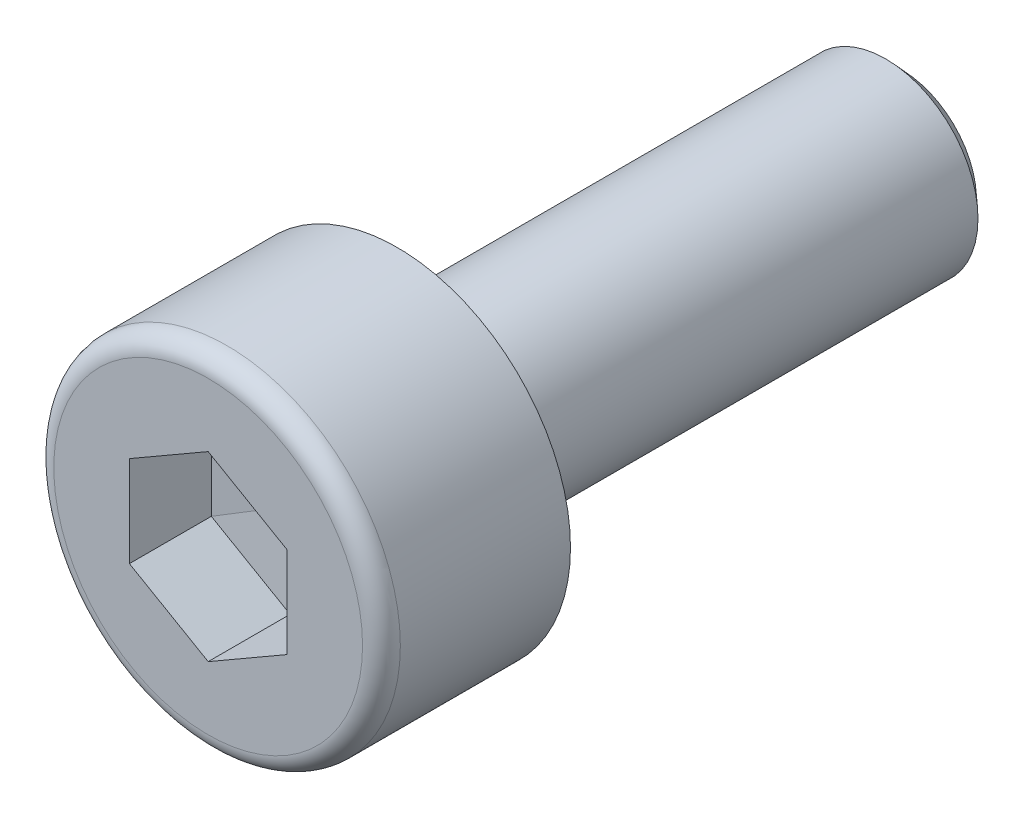
ISO-10303-21;
HEADER;
FILE_DESCRIPTION(('STEP AP214'),'2;1');
FILE_NAME('part.step','',(''),(''),'','','');
FILE_SCHEMA(('AUTOMOTIVE_DESIGN { 1 0 10303 214 1 1 1 1 }'));
ENDSEC;
DATA;
#1=APPLICATION_CONTEXT('core data for automotive mechanical design processes');
#2=APPLICATION_PROTOCOL_DEFINITION('international standard','automotive_design',2000,#1);
#3=PRODUCT_CONTEXT('',#1,'mechanical');
#4=PRODUCT('Part','Part','',(#3));
#5=PRODUCT_RELATED_PRODUCT_CATEGORY('part','',(#4));
#6=PRODUCT_DEFINITION_FORMATION('','',#4);
#7=PRODUCT_DEFINITION_CONTEXT('part definition',#1,'design');
#8=PRODUCT_DEFINITION('design','',#6,#7);
#9=PRODUCT_DEFINITION_SHAPE('','',#8);
#10=(LENGTH_UNIT() NAMED_UNIT(*) SI_UNIT(.MILLI.,.METRE.));
#11=(NAMED_UNIT(*) PLANE_ANGLE_UNIT() SI_UNIT($,.RADIAN.));
#12=(NAMED_UNIT(*) SI_UNIT($,.STERADIAN.) SOLID_ANGLE_UNIT());
#13=UNCERTAINTY_MEASURE_WITH_UNIT(LENGTH_MEASURE(1.E-05),#10,'distance_accuracy_value','');
#14=(GEOMETRIC_REPRESENTATION_CONTEXT(3) GLOBAL_UNCERTAINTY_ASSIGNED_CONTEXT((#13)) GLOBAL_UNIT_ASSIGNED_CONTEXT((#10,
#11,#12)) REPRESENTATION_CONTEXT('',''));
#15=CARTESIAN_POINT('',(0.,0.,0.));
#16=DIRECTION('',(0.,0.,1.));
#17=DIRECTION('',(1.,0.,0.));
#18=AXIS2_PLACEMENT_3D('',#15,#16,#17);
#19=CARTESIAN_POINT('',(-1.49999999999993,0.,0.));
#20=DIRECTION('',(0.,0.,-1.));
#21=DIRECTION('',(0.,-1.,0.));
#22=AXIS2_PLACEMENT_3D('',#19,#20,#21);
#23=PLANE('',#22);
#24=CARTESIAN_POINT('',(0.,0.,0.));
#25=DIRECTION('',(0.,0.,-1.));
#26=DIRECTION('',(-1.,0.,0.));
#27=AXIS2_PLACEMENT_3D('',#24,#25,#26);
#28=CIRCLE('',#27,1.4635);
#29=CARTESIAN_POINT('',(-1.4635,0.,0.));
#30=VERTEX_POINT('',#29);
#31=EDGE_CURVE('E11',#30,#30,#28,.T.);
#32=ORIENTED_EDGE('',*,*,#31,.F.);
#33=EDGE_LOOP('',(#32));
#34=FACE_BOUND('',#33,.T.);
#35=CARTESIAN_POINT('',(0.,0.,-1.23952072181313E-13));
#36=DIRECTION('',(0.,0.,-1.));
#37=DIRECTION('',(1.,0.,0.));
#38=AXIS2_PLACEMENT_3D('',#35,#36,#37);
#39=CIRCLE('',#38,2.74999999999993);
#40=CARTESIAN_POINT('',(2.74999999999993,0.,-1.21303967533006E-13));
#41=VERTEX_POINT('',#40);
#42=EDGE_CURVE('E115',#41,#41,#39,.T.);
#43=ORIENTED_EDGE('',*,*,#42,.T.);
#44=EDGE_LOOP('',(#43));
#45=FACE_BOUND('',#44,.T.);
#46=ADVANCED_FACE('F17',(#34,#45),#23,.T.);
#47=CARTESIAN_POINT('',(0.,0.,-8.));
#48=DIRECTION('',(0.,0.,-1.));
#49=DIRECTION('',(0.,-1.,0.));
#50=AXIS2_PLACEMENT_3D('',#47,#48,#49);
#51=PLANE('',#50);
#52=CARTESIAN_POINT('',(0.,0.,-8.));
#53=DIRECTION('',(0.,0.,-1.));
#54=DIRECTION('',(-1.,0.,0.));
#55=AXIS2_PLACEMENT_3D('',#52,#53,#54);
#56=CIRCLE('',#55,1.193275);
#57=CARTESIAN_POINT('',(-1.193275,0.,-8.));
#58=VERTEX_POINT('',#57);
#59=EDGE_CURVE('E183',#58,#58,#56,.T.);
#60=ORIENTED_EDGE('',*,*,#59,.T.);
#61=EDGE_LOOP('',(#60));
#62=FACE_BOUND('',#61,.T.);
#63=ADVANCED_FACE('F273',(#62),#51,.T.);
#64=CARTESIAN_POINT('',(0.,0.,-4.));
#65=DIRECTION('',(0.,0.,-1.));
#66=DIRECTION('',(-1.,0.,0.));
#67=AXIS2_PLACEMENT_3D('',#64,#65,#66);
#68=CYLINDRICAL_SURFACE('',#67,1.4635);
#69=ORIENTED_EDGE('',*,*,#31,.T.);
#70=EDGE_LOOP('',(#69));
#71=FACE_BOUND('',#70,.T.);
#72=CARTESIAN_POINT('',(0.,0.,-7.75385028398548));
#73=DIRECTION('',(0.,0.,1.));
#74=DIRECTION('',(-1.,0.,0.));
#75=AXIS2_PLACEMENT_3D('',#72,#73,#74);
#76=CIRCLE('',#75,1.4635);
#77=CARTESIAN_POINT('',(-1.46349999999999,0.,-7.75385028398548));
#78=VERTEX_POINT('',#77);
#79=EDGE_CURVE('E180',#78,#78,#76,.T.);
#80=ORIENTED_EDGE('',*,*,#79,.T.);
#81=EDGE_LOOP('',(#80));
#82=FACE_BOUND('',#81,.T.);
#83=ADVANCED_FACE('F257',(#71,#82),#68,.T.);
#84=CARTESIAN_POINT('',(0.,-1.44337567297406,3.));
#85=DIRECTION('',(-0.5,-0.86602540378444,0.));
#86=DIRECTION('',(-0.86602540378444,0.5,0.));
#87=AXIS2_PLACEMENT_3D('',#84,#85,#86);
#88=PLANE('',#87);
#89=DIRECTION('',(-0.86602540378444,0.5,0.));
#90=VECTOR('',#89,1.);
#91=CARTESIAN_POINT('',(-1.34375,-0.667561248750523,2.99999999999987));
#92=LINE('',#91,#90);
#93=CARTESIAN_POINT('',(0.,-1.44337567297406,3.));
#94=VERTEX_POINT('',#93);
#95=CARTESIAN_POINT('',(-1.25000000000003,-0.721687836487028,3.));
#96=VERTEX_POINT('',#95);
#97=EDGE_CURVE('E198',#94,#96,#92,.T.);
#98=ORIENTED_EDGE('',*,*,#97,.F.);
#99=DIRECTION('',(0.,0.,-1.));
#100=VECTOR('',#99,1.);
#101=CARTESIAN_POINT('',(0.,-1.44337567297406,3.));
#102=LINE('',#101,#100);
#103=CARTESIAN_POINT('',(0.,-1.44337567297406,1.7));
#104=VERTEX_POINT('',#103);
#105=EDGE_CURVE('E105',#94,#104,#102,.T.);
#106=ORIENTED_EDGE('',*,*,#105,.T.);
#107=DIRECTION('',(-0.86602540378444,0.5,0.));
#108=VECTOR('',#107,1.);
#109=CARTESIAN_POINT('',(-1.25000000000003,-0.721687836487028,1.7));
#110=LINE('',#109,#108);
#111=CARTESIAN_POINT('',(-1.25000000000003,-0.721687836487028,1.7));
#112=VERTEX_POINT('',#111);
#113=EDGE_CURVE('E164',#104,#112,#110,.T.);
#114=ORIENTED_EDGE('',*,*,#113,.T.);
#115=DIRECTION('',(0.,0.,-1.));
#116=VECTOR('',#115,1.);
#117=CARTESIAN_POINT('',(-1.25000000000003,-0.721687836487028,3.));
#118=LINE('',#117,#116);
#119=EDGE_CURVE('E25',#96,#112,#118,.T.);
#120=ORIENTED_EDGE('',*,*,#119,.F.);
#121=EDGE_LOOP('',(#98,#106,#114,#120));
#122=FACE_BOUND('',#121,.T.);
#123=ADVANCED_FACE('F219',(#122),#88,.F.);
#124=CARTESIAN_POINT('',(-1.25000000000003,-0.721687836487028,3.));
#125=DIRECTION('',(-1.,0.,0.));
#126=DIRECTION('',(0.,0.,1.));
#127=AXIS2_PLACEMENT_3D('',#124,#125,#126);
#128=PLANE('',#127);
#129=DIRECTION('',(0.,1.,0.));
#130=VECTOR('',#129,1.);
#131=CARTESIAN_POINT('',(-1.25000000000003,-0.360843918243514,2.99999999999987));
#132=LINE('',#131,#130);
#133=CARTESIAN_POINT('',(-1.25000000000003,0.72168783648703,3.));
#134=VERTEX_POINT('',#133);
#135=EDGE_CURVE('E127',#96,#134,#132,.T.);
#136=ORIENTED_EDGE('',*,*,#135,.F.);
#137=ORIENTED_EDGE('',*,*,#119,.T.);
#138=DIRECTION('',(0.,1.,0.));
#139=VECTOR('',#138,1.);
#140=CARTESIAN_POINT('',(-1.25000000000003,0.72168783648703,1.7));
#141=LINE('',#140,#139);
#142=CARTESIAN_POINT('',(-1.25000000000003,0.72168783648703,1.7));
#143=VERTEX_POINT('',#142);
#144=EDGE_CURVE('E158',#112,#143,#141,.T.);
#145=ORIENTED_EDGE('',*,*,#144,.T.);
#146=DIRECTION('',(0.,0.,-1.));
#147=VECTOR('',#146,1.);
#148=CARTESIAN_POINT('',(-1.25000000000003,0.72168783648703,3.));
#149=LINE('',#148,#147);
#150=EDGE_CURVE('E46',#134,#143,#149,.T.);
#151=ORIENTED_EDGE('',*,*,#150,.F.);
#152=EDGE_LOOP('',(#136,#137,#145,#151));
#153=FACE_BOUND('',#152,.T.);
#154=ADVANCED_FACE('F379',(#153),#128,.F.);
#155=CARTESIAN_POINT('',(-1.25000000000003,0.72168783648703,3.));
#156=DIRECTION('',(-0.499999999999974,0.866025403784454,0.));
#157=DIRECTION('',(0.,0.,1.));
#158=AXIS2_PLACEMENT_3D('',#155,#156,#157);
#159=PLANE('',#158);
#160=DIRECTION('',(0.866025403784453,0.499999999999974,0.));
#161=VECTOR('',#160,1.);
#162=CARTESIAN_POINT('',(-1.96875,0.306717330507028,2.99999999999987));
#163=LINE('',#162,#161);
#164=CARTESIAN_POINT('',(0.,1.44337567297404,3.));
#165=VERTEX_POINT('',#164);
#166=EDGE_CURVE('E120',#134,#165,#163,.T.);
#167=ORIENTED_EDGE('',*,*,#166,.F.);
#168=ORIENTED_EDGE('',*,*,#150,.T.);
#169=DIRECTION('',(0.866025403784453,0.499999999999974,0.));
#170=VECTOR('',#169,1.);
#171=CARTESIAN_POINT('',(0.,1.44337567297404,1.7));
#172=LINE('',#171,#170);
#173=CARTESIAN_POINT('',(0.,1.44337567297404,1.7));
#174=VERTEX_POINT('',#173);
#175=EDGE_CURVE('E151',#143,#174,#172,.T.);
#176=ORIENTED_EDGE('',*,*,#175,.T.);
#177=DIRECTION('',(0.,0.,-1.));
#178=VECTOR('',#177,1.);
#179=CARTESIAN_POINT('',(0.,1.44337567297404,3.));
#180=LINE('',#179,#178);
#181=EDGE_CURVE('E104',#165,#174,#180,.T.);
#182=ORIENTED_EDGE('',*,*,#181,.F.);
#183=EDGE_LOOP('',(#167,#168,#176,#182));
#184=FACE_BOUND('',#183,.T.);
#185=ADVANCED_FACE('F434',(#184),#159,.F.);
#186=CARTESIAN_POINT('',(0.,1.44337567297404,3.));
#187=DIRECTION('',(0.5,0.866025403784439,0.));
#188=DIRECTION('',(0.,0.,-1.));
#189=AXIS2_PLACEMENT_3D('',#186,#187,#188);
#190=PLANE('',#189);
#191=DIRECTION('',(0.866025403784439,-0.5,0.));
#192=VECTOR('',#191,1.);
#193=CARTESIAN_POINT('',(-0.718749999999979,1.85834617895407,2.99999999999987));
#194=LINE('',#193,#192);
#195=CARTESIAN_POINT('',(1.24999999999997,0.721687836487028,3.));
#196=VERTEX_POINT('',#195);
#197=EDGE_CURVE('E96',#165,#196,#194,.T.);
#198=ORIENTED_EDGE('',*,*,#197,.F.);
#199=ORIENTED_EDGE('',*,*,#181,.T.);
#200=DIRECTION('',(0.866025403784439,-0.5,0.));
#201=VECTOR('',#200,1.);
#202=CARTESIAN_POINT('',(1.24999999999997,0.721687836487028,1.7));
#203=LINE('',#202,#201);
#204=CARTESIAN_POINT('',(1.24999999999997,0.721687836487028,1.7));
#205=VERTEX_POINT('',#204);
#206=EDGE_CURVE('E99',#174,#205,#203,.T.);
#207=ORIENTED_EDGE('',*,*,#206,.T.);
#208=DIRECTION('',(0.,0.,-1.));
#209=VECTOR('',#208,1.);
#210=CARTESIAN_POINT('',(1.24999999999997,0.721687836487028,3.));
#211=LINE('',#210,#209);
#212=EDGE_CURVE('E92',#196,#205,#211,.T.);
#213=ORIENTED_EDGE('',*,*,#212,.F.);
#214=EDGE_LOOP('',(#198,#199,#207,#213));
#215=FACE_BOUND('',#214,.T.);
#216=ADVANCED_FACE('F94',(#215),#190,.F.);
#217=CARTESIAN_POINT('',(1.24999999999997,0.721687836487028,3.));
#218=DIRECTION('',(1.,0.,0.));
#219=DIRECTION('',(0.,1.,0.));
#220=AXIS2_PLACEMENT_3D('',#217,#218,#219);
#221=PLANE('',#220);
#222=DIRECTION('',(0.,-1.,0.));
#223=VECTOR('',#222,1.);
#224=CARTESIAN_POINT('',(1.24999999999997,0.360843918243514,2.99999999999987));
#225=LINE('',#224,#223);
#226=CARTESIAN_POINT('',(1.24999999999997,-0.721687836487029,3.));
#227=VERTEX_POINT('',#226);
#228=EDGE_CURVE('E108',#196,#227,#225,.T.);
#229=ORIENTED_EDGE('',*,*,#228,.F.);
#230=ORIENTED_EDGE('',*,*,#212,.T.);
#231=DIRECTION('',(0.,-1.,0.));
#232=VECTOR('',#231,1.);
#233=CARTESIAN_POINT('',(1.24999999999997,-0.721687836487029,1.7));
#234=LINE('',#233,#232);
#235=CARTESIAN_POINT('',(1.24999999999997,-0.721687836487029,1.7));
#236=VERTEX_POINT('',#235);
#237=EDGE_CURVE('E141',#205,#236,#234,.T.);
#238=ORIENTED_EDGE('',*,*,#237,.T.);
#239=DIRECTION('',(0.,0.,-1.));
#240=VECTOR('',#239,1.);
#241=CARTESIAN_POINT('',(1.24999999999997,-0.721687836487029,3.));
#242=LINE('',#241,#240);
#243=EDGE_CURVE('E110',#227,#236,#242,.T.);
#244=ORIENTED_EDGE('',*,*,#243,.F.);
#245=EDGE_LOOP('',(#229,#230,#238,#244));
#246=FACE_BOUND('',#245,.T.);
#247=ADVANCED_FACE('F109',(#246),#221,.F.);
#248=CARTESIAN_POINT('',(1.24999999999997,-0.721687836487029,3.));
#249=DIRECTION('',(0.5,-0.866025403784438,0.));
#250=DIRECTION('',(0.,0.,-1.));
#251=AXIS2_PLACEMENT_3D('',#248,#249,#250);
#252=PLANE('',#251);
#253=DIRECTION('',(-0.866025403784438,-0.5,0.));
#254=VECTOR('',#253,1.);
#255=CARTESIAN_POINT('',(-0.0937499999999922,-1.49750226071057,2.99999999999987));
#256=LINE('',#255,#254);
#257=EDGE_CURVE('E195',#227,#94,#256,.T.);
#258=ORIENTED_EDGE('',*,*,#257,.F.);
#259=ORIENTED_EDGE('',*,*,#243,.T.);
#260=DIRECTION('',(-0.866025403784438,-0.5,0.));
#261=VECTOR('',#260,1.);
#262=CARTESIAN_POINT('',(0.,-1.44337567297406,1.7));
#263=LINE('',#262,#261);
#264=EDGE_CURVE('E136',#236,#104,#263,.T.);
#265=ORIENTED_EDGE('',*,*,#264,.T.);
#266=ORIENTED_EDGE('',*,*,#105,.F.);
#267=EDGE_LOOP('',(#258,#259,#265,#266));
#268=FACE_BOUND('',#267,.T.);
#269=ADVANCED_FACE('F208',(#268),#252,.F.);
#270=CARTESIAN_POINT('',(-1.25000000000003,-0.721687836487028,1.7));
#271=DIRECTION('',(-0.0435778713738289,-0.0754790873051734,-0.996194698091746));
#272=DIRECTION('',(0.,-0.997141949694317,0.0755508581011306));
#273=AXIS2_PLACEMENT_3D('',#270,#271,#272);
#274=PLANE('',#273);
#275=DIRECTION('',(0.863550259614422,0.498570974847159,-0.0755508581011306));
#276=VECTOR('',#275,1.);
#277=CARTESIAN_POINT('',(-0.939283728799974,-0.542295713668079,1.67281584869695));
#278=LINE('',#277,#276);
#279=CARTESIAN_POINT('',(0.,0.,1.5906391705926));
#280=VERTEX_POINT('',#279);
#281=EDGE_CURVE('E161',#112,#280,#278,.T.);
#282=ORIENTED_EDGE('',*,*,#281,.F.);
#283=ORIENTED_EDGE('',*,*,#113,.F.);
#284=DIRECTION('',(0.,0.997141949694317,-0.0755508581011306));
#285=VECTOR('',#284,1.);
#286=CARTESIAN_POINT('',(0.,-1.08459142733616,1.67281584869695));
#287=LINE('',#286,#285);
#288=EDGE_CURVE('E132',#104,#280,#287,.T.);
#289=ORIENTED_EDGE('',*,*,#288,.T.);
#290=EDGE_LOOP('',(#282,#283,#289));
#291=FACE_BOUND('',#290,.T.);
#292=ADVANCED_FACE('F216',(#291),#274,.F.);
#293=CARTESIAN_POINT('',(-1.25000000000003,0.72168783648703,1.7));
#294=DIRECTION('',(-0.0871557427476581,0.,-0.996194698091746));
#295=DIRECTION('',(-0.996194698091746,0.,0.0871557427476581));
#296=AXIS2_PLACEMENT_3D('',#293,#294,#295);
#297=PLANE('',#296);
#298=DIRECTION('',(0.863550259614416,-0.498570974847171,-0.0755508581011299));
#299=VECTOR('',#298,1.);
#300=CARTESIAN_POINT('',(-0.939283728799963,0.54229571366807,1.67281584869695));
#301=LINE('',#300,#299);
#302=EDGE_CURVE('E154',#143,#280,#301,.T.);
#303=ORIENTED_EDGE('',*,*,#302,.F.);
#304=ORIENTED_EDGE('',*,*,#144,.F.);
#305=ORIENTED_EDGE('',*,*,#281,.T.);
#306=EDGE_LOOP('',(#303,#304,#305));
#307=FACE_BOUND('',#306,.T.);
#308=ADVANCED_FACE('F348',(#307),#297,.F.);
#309=CARTESIAN_POINT('',(0.,1.44337567297404,1.7));
#310=DIRECTION('',(-0.0435778713738268,0.0754790873051746,-0.996194698091746));
#311=DIRECTION('',(-0.999044587684655,0.,0.0437025378896668));
#312=AXIS2_PLACEMENT_3D('',#309,#310,#311);
#313=PLANE('',#312);
#314=DIRECTION('',(0.,-0.997141949694316,-0.0755508581011312));
#315=VECTOR('',#314,1.);
#316=CARTESIAN_POINT('',(0.,1.08459142733616,1.67281584869695));
#317=LINE('',#316,#315);
#318=EDGE_CURVE('E150',#174,#280,#317,.T.);
#319=ORIENTED_EDGE('',*,*,#318,.F.);
#320=ORIENTED_EDGE('',*,*,#175,.F.);
#321=ORIENTED_EDGE('',*,*,#302,.T.);
#322=EDGE_LOOP('',(#319,#320,#321));
#323=FACE_BOUND('',#322,.T.);
#324=ADVANCED_FACE('F411',(#323),#313,.F.);
#325=CARTESIAN_POINT('',(1.24999999999997,0.721687836487028,1.7));
#326=DIRECTION('',(0.043577871373829,0.0754790873051734,-0.996194698091746));
#327=DIRECTION('',(-0.999044587684655,0.,-0.043702537889669));
#328=AXIS2_PLACEMENT_3D('',#325,#326,#327);
#329=PLANE('',#328);
#330=DIRECTION('',(-0.863550259614423,-0.498570974847159,-0.0755508581011305));
#331=VECTOR('',#330,1.);
#332=CARTESIAN_POINT('',(0.939283728799916,0.542295713668077,1.67281584869695));
#333=LINE('',#332,#331);
#334=EDGE_CURVE('E144',#205,#280,#333,.T.);
#335=ORIENTED_EDGE('',*,*,#334,.F.);
#336=ORIENTED_EDGE('',*,*,#206,.F.);
#337=ORIENTED_EDGE('',*,*,#318,.T.);
#338=EDGE_LOOP('',(#335,#336,#337));
#339=FACE_BOUND('',#338,.T.);
#340=ADVANCED_FACE('F402',(#339),#329,.F.);
#341=CARTESIAN_POINT('',(1.24999999999997,-0.721687836487029,1.7));
#342=DIRECTION('',(0.0871557427476581,0.,-0.996194698091746));
#343=DIRECTION('',(0.,-1.,0.));
#344=AXIS2_PLACEMENT_3D('',#341,#342,#343);
#345=PLANE('',#344);
#346=DIRECTION('',(-0.863550259614423,0.498570974847158,-0.0755508581011306));
#347=VECTOR('',#346,1.);
#348=CARTESIAN_POINT('',(0.939283728799915,-0.542295713668082,1.67281584869695));
#349=LINE('',#348,#347);
#350=EDGE_CURVE('E137',#236,#280,#349,.T.);
#351=ORIENTED_EDGE('',*,*,#350,.F.);
#352=ORIENTED_EDGE('',*,*,#237,.F.);
#353=ORIENTED_EDGE('',*,*,#334,.T.);
#354=EDGE_LOOP('',(#351,#352,#353));
#355=FACE_BOUND('',#354,.T.);
#356=ADVANCED_FACE('F358',(#355),#345,.F.);
#357=CARTESIAN_POINT('',(0.,-1.44337567297406,1.7));
#358=DIRECTION('',(0.0435778713738292,-0.0754790873051732,-0.996194698091746));
#359=DIRECTION('',(0.,-0.997141949694317,0.0755508581011304));
#360=AXIS2_PLACEMENT_3D('',#357,#358,#359);
#361=PLANE('',#360);
#362=ORIENTED_EDGE('',*,*,#288,.F.);
#363=ORIENTED_EDGE('',*,*,#264,.F.);
#364=ORIENTED_EDGE('',*,*,#350,.T.);
#365=EDGE_LOOP('',(#362,#363,#364));
#366=FACE_BOUND('',#365,.T.);
#367=ADVANCED_FACE('F211',(#366),#361,.F.);
#368=CARTESIAN_POINT('',(0.,0.,1.49999999999987));
#369=DIRECTION('',(0.,0.,-1.));
#370=DIRECTION('',(-1.,0.,0.));
#371=AXIS2_PLACEMENT_3D('',#368,#369,#370);
#372=CYLINDRICAL_SURFACE('',#371,2.74999999999993);
#373=CARTESIAN_POINT('',(0.,0.,2.69999999999987));
#374=DIRECTION('',(0.,0.,1.));
#375=DIRECTION('',(1.,0.,0.));
#376=AXIS2_PLACEMENT_3D('',#373,#374,#375);
#377=CIRCLE('',#376,2.74999999999993);
#378=CARTESIAN_POINT('',(2.74999999999993,0.,2.69999999999987));
#379=VERTEX_POINT('',#378);
#380=EDGE_CURVE('E187',#379,#379,#377,.T.);
#381=ORIENTED_EDGE('',*,*,#380,.F.);
#382=EDGE_LOOP('',(#381));
#383=FACE_BOUND('',#382,.T.);
#384=ORIENTED_EDGE('',*,*,#42,.F.);
#385=EDGE_LOOP('',(#384));
#386=FACE_BOUND('',#385,.T.);
#387=ADVANCED_FACE('F357',(#383,#386),#372,.T.);
#388=CARTESIAN_POINT('',(-2.74999999999994,0.,2.99999999999987));
#389=DIRECTION('',(0.,0.,1.));
#390=DIRECTION('',(1.,0.,0.));
#391=AXIS2_PLACEMENT_3D('',#388,#389,#390);
#392=PLANE('',#391);
#393=ORIENTED_EDGE('',*,*,#257,.T.);
#394=ORIENTED_EDGE('',*,*,#97,.T.);
#395=ORIENTED_EDGE('',*,*,#135,.T.);
#396=ORIENTED_EDGE('',*,*,#166,.T.);
#397=ORIENTED_EDGE('',*,*,#197,.T.);
#398=ORIENTED_EDGE('',*,*,#228,.T.);
#399=EDGE_LOOP('',(#393,#394,#395,#396,#397,#398));
#400=FACE_BOUND('',#399,.T.);
#401=CARTESIAN_POINT('',(0.,0.,2.99999999999987));
#402=DIRECTION('',(0.,0.,-1.));
#403=DIRECTION('',(1.,0.,0.));
#404=AXIS2_PLACEMENT_3D('',#401,#402,#403);
#405=CIRCLE('',#404,2.44999999999993);
#406=CARTESIAN_POINT('',(2.44999999999993,0.,2.99999999999987));
#407=VERTEX_POINT('',#406);
#408=EDGE_CURVE('E194',#407,#407,#405,.T.);
#409=ORIENTED_EDGE('',*,*,#408,.F.);
#410=EDGE_LOOP('',(#409));
#411=FACE_BOUND('',#410,.T.);
#412=ADVANCED_FACE('F117',(#400,#411),#392,.T.);
#413=CARTESIAN_POINT('',(0.,0.,2.69999999999987));
#414=DIRECTION('',(0.,0.,-1.));
#415=DIRECTION('',(-1.,0.,0.));
#416=AXIS2_PLACEMENT_3D('',#413,#414,#415);
#417=TOROIDAL_SURFACE('',#416,2.44999999999993,0.3);
#418=ORIENTED_EDGE('',*,*,#408,.T.);
#419=EDGE_LOOP('',(#418));
#420=FACE_BOUND('',#419,.T.);
#421=ORIENTED_EDGE('',*,*,#380,.T.);
#422=EDGE_LOOP('',(#421));
#423=FACE_BOUND('',#422,.T.);
#424=ADVANCED_FACE('F261',(#420,#423),#417,.T.);
#425=CARTESIAN_POINT('',(0.,0.,-7.8466375));
#426=DIRECTION('',(0.,0.,1.));
#427=DIRECTION('',(-1.,0.,0.));
#428=AXIS2_PLACEMENT_3D('',#425,#426,#427);
#429=CONICAL_SURFACE('',#428,1.36163750000002,0.831988093683093);
#430=ORIENTED_EDGE('',*,*,#59,.F.);
#431=EDGE_LOOP('',(#430));
#432=FACE_BOUND('',#431,.T.);
#433=ORIENTED_EDGE('',*,*,#79,.F.);
#434=EDGE_LOOP('',(#433));
#435=FACE_BOUND('',#434,.T.);
#436=ADVANCED_FACE('F259',(#432,#435),#429,.T.);
#437=CLOSED_SHELL('',(#46,#63,#83,#123,#154,#185,#216,#247,#269,#292,#308,#324,#340,#356,#367,
#387,#412,#424,#436));
#438=MANIFOLD_SOLID_BREP('B1',#437);
#439=ADVANCED_BREP_SHAPE_REPRESENTATION('',(#18,#438),#14);
#440=SHAPE_DEFINITION_REPRESENTATION(#9,#439);
ENDSEC;
END-ISO-10303-21;
